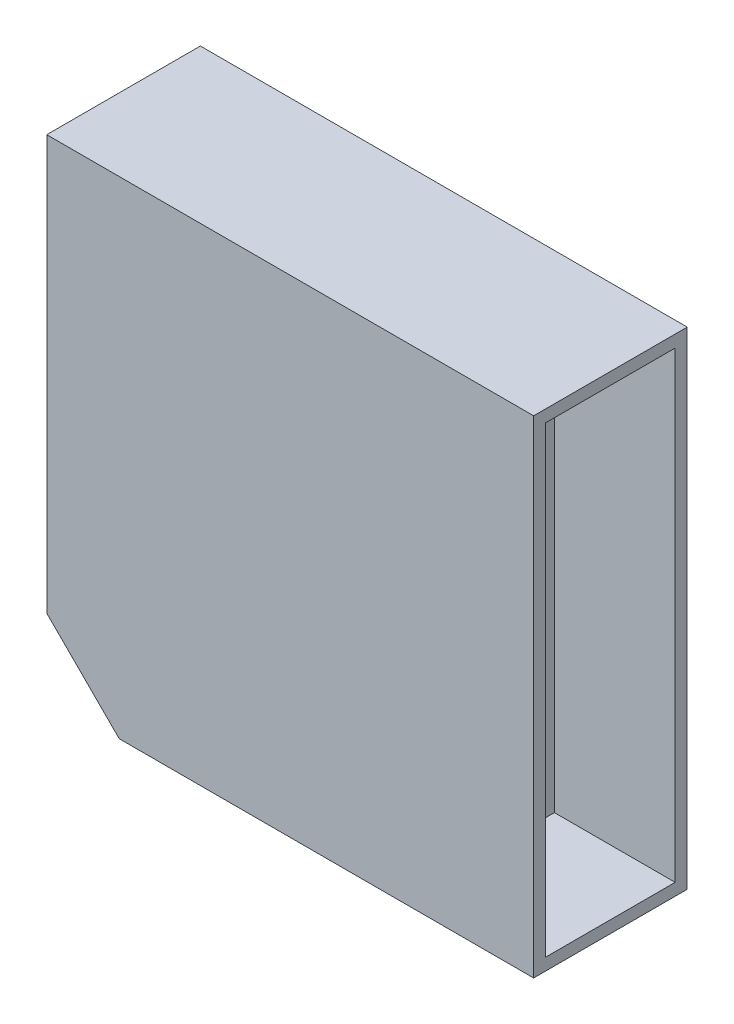
ISO-10303-21;
HEADER;
FILE_DESCRIPTION(('STEP AP214'),'2;1');
FILE_NAME('part.step','',(''),(''),'','','');
FILE_SCHEMA(('AUTOMOTIVE_DESIGN { 1 0 10303 214 1 1 1 1 }'));
ENDSEC;
DATA;
#1=APPLICATION_CONTEXT('core data for automotive mechanical design processes');
#2=APPLICATION_PROTOCOL_DEFINITION('international standard','automotive_design',2000,#1);
#3=PRODUCT_CONTEXT('',#1,'mechanical');
#4=PRODUCT('Part','Part','',(#3));
#5=PRODUCT_RELATED_PRODUCT_CATEGORY('part','',(#4));
#6=PRODUCT_DEFINITION_FORMATION('','',#4);
#7=PRODUCT_DEFINITION_CONTEXT('part definition',#1,'design');
#8=PRODUCT_DEFINITION('design','',#6,#7);
#9=PRODUCT_DEFINITION_SHAPE('','',#8);
#10=(LENGTH_UNIT() NAMED_UNIT(*) SI_UNIT(.MILLI.,.METRE.));
#11=(NAMED_UNIT(*) PLANE_ANGLE_UNIT() SI_UNIT($,.RADIAN.));
#12=(NAMED_UNIT(*) SI_UNIT($,.STERADIAN.) SOLID_ANGLE_UNIT());
#13=UNCERTAINTY_MEASURE_WITH_UNIT(LENGTH_MEASURE(1.E-05),#10,'distance_accuracy_value','');
#14=(GEOMETRIC_REPRESENTATION_CONTEXT(3) GLOBAL_UNCERTAINTY_ASSIGNED_CONTEXT((#13)) GLOBAL_UNIT_ASSIGNED_CONTEXT((#10,
#11,#12)) REPRESENTATION_CONTEXT('',''));
#15=CARTESIAN_POINT('',(0.,0.,0.));
#16=DIRECTION('',(0.,0.,1.));
#17=DIRECTION('',(1.,0.,0.));
#18=AXIS2_PLACEMENT_3D('',#15,#16,#17);
#19=CARTESIAN_POINT('',(10.08,10.08,6.36));
#20=DIRECTION('',(-1.,0.,0.));
#21=DIRECTION('',(0.,-1.,0.));
#22=AXIS2_PLACEMENT_3D('',#19,#20,#21);
#23=PLANE('',#22);
#24=DIRECTION('',(0.,1.,0.));
#25=VECTOR('',#24,1.);
#26=CARTESIAN_POINT('',(10.08,-9.58,0.5));
#27=LINE('',#26,#25);
#28=CARTESIAN_POINT('',(10.08,-9.58,0.5));
#29=VERTEX_POINT('',#28);
#30=CARTESIAN_POINT('',(10.08,9.58,0.5));
#31=VERTEX_POINT('',#30);
#32=EDGE_CURVE('E138',#29,#31,#27,.T.);
#33=ORIENTED_EDGE('',*,*,#32,.F.);
#34=DIRECTION('',(0.,0.,-1.));
#35=VECTOR('',#34,1.);
#36=CARTESIAN_POINT('',(10.08,-9.58,5.86));
#37=LINE('',#36,#35);
#38=CARTESIAN_POINT('',(10.08,-9.58,5.86));
#39=VERTEX_POINT('',#38);
#40=EDGE_CURVE('E112',#39,#29,#37,.T.);
#41=ORIENTED_EDGE('',*,*,#40,.F.);
#42=DIRECTION('',(0.,-1.,0.));
#43=VECTOR('',#42,1.);
#44=CARTESIAN_POINT('',(10.08,9.58,5.86));
#45=LINE('',#44,#43);
#46=CARTESIAN_POINT('',(10.08,9.58,5.86));
#47=VERTEX_POINT('',#46);
#48=EDGE_CURVE('E129',#47,#39,#45,.T.);
#49=ORIENTED_EDGE('',*,*,#48,.F.);
#50=DIRECTION('',(0.,0.,1.));
#51=VECTOR('',#50,1.);
#52=CARTESIAN_POINT('',(10.08,9.58,0.5));
#53=LINE('',#52,#51);
#54=EDGE_CURVE('E132',#31,#47,#53,.T.);
#55=ORIENTED_EDGE('',*,*,#54,.F.);
#56=EDGE_LOOP('',(#33,#41,#49,#55));
#57=FACE_BOUND('',#56,.T.);
#58=DIRECTION('',(0.,1.,0.));
#59=VECTOR('',#58,1.);
#60=CARTESIAN_POINT('',(10.08,10.08,0.));
#61=LINE('',#60,#59);
#62=CARTESIAN_POINT('',(10.08,-10.08,0.));
#63=VERTEX_POINT('',#62);
#64=CARTESIAN_POINT('',(10.08,10.08,0.));
#65=VERTEX_POINT('',#64);
#66=EDGE_CURVE('E144',#63,#65,#61,.T.);
#67=ORIENTED_EDGE('',*,*,#66,.T.);
#68=DIRECTION('',(0.,0.,-1.));
#69=VECTOR('',#68,1.);
#70=CARTESIAN_POINT('',(10.08,10.08,6.36));
#71=LINE('',#70,#69);
#72=CARTESIAN_POINT('',(10.08,10.08,6.36));
#73=VERTEX_POINT('',#72);
#74=EDGE_CURVE('E171',#73,#65,#71,.T.);
#75=ORIENTED_EDGE('',*,*,#74,.F.);
#76=DIRECTION('',(0.,1.,0.));
#77=VECTOR('',#76,1.);
#78=CARTESIAN_POINT('',(10.08,10.08,6.36));
#79=LINE('',#78,#77);
#80=CARTESIAN_POINT('',(10.08,-10.08,6.36));
#81=VERTEX_POINT('',#80);
#82=EDGE_CURVE('E148',#81,#73,#79,.T.);
#83=ORIENTED_EDGE('',*,*,#82,.F.);
#84=DIRECTION('',(0.,0.,-1.));
#85=VECTOR('',#84,1.);
#86=CARTESIAN_POINT('',(10.08,-10.08,6.36));
#87=LINE('',#86,#85);
#88=EDGE_CURVE('E158',#81,#63,#87,.T.);
#89=ORIENTED_EDGE('',*,*,#88,.T.);
#90=EDGE_LOOP('',(#67,#75,#83,#89));
#91=FACE_BOUND('',#90,.T.);
#92=ADVANCED_FACE('F34',(#57,#91),#23,.F.);
#93=CARTESIAN_POINT('',(-10.08,10.08,6.36));
#94=DIRECTION('',(0.,-1.,0.));
#95=DIRECTION('',(0.,0.,-1.));
#96=AXIS2_PLACEMENT_3D('',#93,#94,#95);
#97=PLANE('',#96);
#98=DIRECTION('',(-1.,0.,0.));
#99=VECTOR('',#98,1.);
#100=CARTESIAN_POINT('',(-10.08,10.08,0.));
#101=LINE('',#100,#99);
#102=CARTESIAN_POINT('',(-10.08,10.08,0.));
#103=VERTEX_POINT('',#102);
#104=EDGE_CURVE('E161',#65,#103,#101,.T.);
#105=ORIENTED_EDGE('',*,*,#104,.T.);
#106=DIRECTION('',(0.,0.,-1.));
#107=VECTOR('',#106,1.);
#108=CARTESIAN_POINT('',(-10.08,10.08,6.36));
#109=LINE('',#108,#107);
#110=CARTESIAN_POINT('',(-10.08,10.08,6.36));
#111=VERTEX_POINT('',#110);
#112=EDGE_CURVE('E168',#111,#103,#109,.T.);
#113=ORIENTED_EDGE('',*,*,#112,.F.);
#114=DIRECTION('',(-1.,0.,0.));
#115=VECTOR('',#114,1.);
#116=CARTESIAN_POINT('',(-10.08,10.08,6.36));
#117=LINE('',#116,#115);
#118=EDGE_CURVE('E151',#73,#111,#117,.T.);
#119=ORIENTED_EDGE('',*,*,#118,.F.);
#120=ORIENTED_EDGE('',*,*,#74,.T.);
#121=EDGE_LOOP('',(#105,#113,#119,#120));
#122=FACE_BOUND('',#121,.T.);
#123=ADVANCED_FACE('F198',(#122),#97,.F.);
#124=CARTESIAN_POINT('',(-10.08,10.08,6.36));
#125=DIRECTION('',(1.,0.,0.));
#126=DIRECTION('',(0.,1.,0.));
#127=AXIS2_PLACEMENT_3D('',#124,#125,#126);
#128=PLANE('',#127);
#129=DIRECTION('',(0.,-1.,0.));
#130=VECTOR('',#129,1.);
#131=CARTESIAN_POINT('',(-10.08,10.08,0.));
#132=LINE('',#131,#130);
#133=CARTESIAN_POINT('',(-10.08,-7.07999999999998,0.));
#134=VERTEX_POINT('',#133);
#135=EDGE_CURVE('E163',#103,#134,#132,.T.);
#136=ORIENTED_EDGE('',*,*,#135,.T.);
#137=DIRECTION('',(0.,0.,1.));
#138=VECTOR('',#137,1.);
#139=CARTESIAN_POINT('',(-10.08,-7.07999999999998,6.36));
#140=LINE('',#139,#138);
#141=CARTESIAN_POINT('',(-10.08,-7.07999999999998,6.36));
#142=VERTEX_POINT('',#141);
#143=EDGE_CURVE('E42',#134,#142,#140,.T.);
#144=ORIENTED_EDGE('',*,*,#143,.T.);
#145=DIRECTION('',(0.,-1.,0.));
#146=VECTOR('',#145,1.);
#147=CARTESIAN_POINT('',(-10.08,10.08,6.36));
#148=LINE('',#147,#146);
#149=EDGE_CURVE('E154',#111,#142,#148,.T.);
#150=ORIENTED_EDGE('',*,*,#149,.F.);
#151=ORIENTED_EDGE('',*,*,#112,.T.);
#152=EDGE_LOOP('',(#136,#144,#150,#151));
#153=FACE_BOUND('',#152,.T.);
#154=ADVANCED_FACE('F203',(#153),#128,.F.);
#155=CARTESIAN_POINT('',(-10.08,-10.08,6.36));
#156=DIRECTION('',(0.,1.,0.));
#157=DIRECTION('',(0.,0.,1.));
#158=AXIS2_PLACEMENT_3D('',#155,#156,#157);
#159=PLANE('',#158);
#160=DIRECTION('',(1.,0.,0.));
#161=VECTOR('',#160,1.);
#162=CARTESIAN_POINT('',(-10.08,-10.08,6.36));
#163=LINE('',#162,#161);
#164=CARTESIAN_POINT('',(-7.08,-10.08,6.36));
#165=VERTEX_POINT('',#164);
#166=EDGE_CURVE('E156',#165,#81,#163,.T.);
#167=ORIENTED_EDGE('',*,*,#166,.F.);
#168=DIRECTION('',(0.,0.,-1.));
#169=VECTOR('',#168,1.);
#170=CARTESIAN_POINT('',(-7.08,-10.08,6.36));
#171=LINE('',#170,#169);
#172=CARTESIAN_POINT('',(-7.08,-10.08,0.));
#173=VERTEX_POINT('',#172);
#174=EDGE_CURVE('E174',#165,#173,#171,.T.);
#175=ORIENTED_EDGE('',*,*,#174,.T.);
#176=DIRECTION('',(1.,0.,0.));
#177=VECTOR('',#176,1.);
#178=CARTESIAN_POINT('',(-10.08,-10.08,0.));
#179=LINE('',#178,#177);
#180=EDGE_CURVE('E152',#173,#63,#179,.T.);
#181=ORIENTED_EDGE('',*,*,#180,.T.);
#182=ORIENTED_EDGE('',*,*,#88,.F.);
#183=EDGE_LOOP('',(#167,#175,#181,#182));
#184=FACE_BOUND('',#183,.T.);
#185=ADVANCED_FACE('F180',(#184),#159,.F.);
#186=CARTESIAN_POINT('',(0.,0.,6.36));
#187=DIRECTION('',(0.,0.,1.));
#188=DIRECTION('',(1.,0.,0.));
#189=AXIS2_PLACEMENT_3D('',#186,#187,#188);
#190=PLANE('',#189);
#191=ORIENTED_EDGE('',*,*,#149,.T.);
#192=DIRECTION('',(-0.707106781186545,0.70710678118655,0.));
#193=VECTOR('',#192,1.);
#194=CARTESIAN_POINT('',(-8.58000000000002,-8.57999999999997,6.36));
#195=LINE('',#194,#193);
#196=EDGE_CURVE('E11',#142,#165,#195,.F.);
#197=ORIENTED_EDGE('',*,*,#196,.T.);
#198=ORIENTED_EDGE('',*,*,#166,.T.);
#199=ORIENTED_EDGE('',*,*,#82,.T.);
#200=ORIENTED_EDGE('',*,*,#118,.T.);
#201=EDGE_LOOP('',(#191,#197,#198,#199,#200));
#202=FACE_BOUND('',#201,.T.);
#203=ADVANCED_FACE('F190',(#202),#190,.T.);
#204=CARTESIAN_POINT('',(0.,0.,0.));
#205=DIRECTION('',(0.,0.,1.));
#206=DIRECTION('',(1.,0.,0.));
#207=AXIS2_PLACEMENT_3D('',#204,#205,#206);
#208=PLANE('',#207);
#209=ORIENTED_EDGE('',*,*,#180,.F.);
#210=DIRECTION('',(0.707106781186545,-0.70710678118655,0.));
#211=VECTOR('',#210,1.);
#212=CARTESIAN_POINT('',(-7.08,-10.08,0.));
#213=LINE('',#212,#211);
#214=EDGE_CURVE('E56',#173,#134,#213,.F.);
#215=ORIENTED_EDGE('',*,*,#214,.T.);
#216=ORIENTED_EDGE('',*,*,#135,.F.);
#217=ORIENTED_EDGE('',*,*,#104,.F.);
#218=ORIENTED_EDGE('',*,*,#66,.F.);
#219=EDGE_LOOP('',(#209,#215,#216,#217,#218));
#220=FACE_BOUND('',#219,.T.);
#221=ADVANCED_FACE('F185',(#220),#208,.F.);
#222=CARTESIAN_POINT('',(5.08,-9.58,5.86));
#223=DIRECTION('',(0.,-1.,0.));
#224=DIRECTION('',(1.,0.,0.));
#225=AXIS2_PLACEMENT_3D('',#222,#223,#224);
#226=PLANE('',#225);
#227=ORIENTED_EDGE('',*,*,#40,.T.);
#228=DIRECTION('',(1.,0.,0.));
#229=VECTOR('',#228,1.);
#230=CARTESIAN_POINT('',(5.08,-9.58,0.5));
#231=LINE('',#230,#229);
#232=CARTESIAN_POINT('',(5.08,-9.58,0.5));
#233=VERTEX_POINT('',#232);
#234=EDGE_CURVE('E105',#233,#29,#231,.T.);
#235=ORIENTED_EDGE('',*,*,#234,.F.);
#236=DIRECTION('',(0.,0.,-1.));
#237=VECTOR('',#236,1.);
#238=CARTESIAN_POINT('',(5.08,-9.58,5.86));
#239=LINE('',#238,#237);
#240=CARTESIAN_POINT('',(5.08,-9.58,5.86));
#241=VERTEX_POINT('',#240);
#242=EDGE_CURVE('E109',#241,#233,#239,.T.);
#243=ORIENTED_EDGE('',*,*,#242,.F.);
#244=DIRECTION('',(1.,0.,0.));
#245=VECTOR('',#244,1.);
#246=CARTESIAN_POINT('',(5.08,-9.58,5.86));
#247=LINE('',#246,#245);
#248=EDGE_CURVE('E142',#241,#39,#247,.T.);
#249=ORIENTED_EDGE('',*,*,#248,.T.);
#250=EDGE_LOOP('',(#227,#235,#243,#249));
#251=FACE_BOUND('',#250,.T.);
#252=ADVANCED_FACE('F107',(#251),#226,.F.);
#253=CARTESIAN_POINT('',(5.08,9.58,5.86));
#254=DIRECTION('',(0.,0.,1.));
#255=DIRECTION('',(1.,0.,0.));
#256=AXIS2_PLACEMENT_3D('',#253,#254,#255);
#257=PLANE('',#256);
#258=ORIENTED_EDGE('',*,*,#48,.T.);
#259=ORIENTED_EDGE('',*,*,#248,.F.);
#260=DIRECTION('',(0.,-1.,0.));
#261=VECTOR('',#260,1.);
#262=CARTESIAN_POINT('',(5.08,9.58,5.86));
#263=LINE('',#262,#261);
#264=CARTESIAN_POINT('',(5.08,9.58,5.86));
#265=VERTEX_POINT('',#264);
#266=EDGE_CURVE('E117',#265,#241,#263,.T.);
#267=ORIENTED_EDGE('',*,*,#266,.F.);
#268=DIRECTION('',(1.,0.,0.));
#269=VECTOR('',#268,1.);
#270=CARTESIAN_POINT('',(5.08,9.58,5.86));
#271=LINE('',#270,#269);
#272=EDGE_CURVE('E145',#265,#47,#271,.T.);
#273=ORIENTED_EDGE('',*,*,#272,.T.);
#274=EDGE_LOOP('',(#258,#259,#267,#273));
#275=FACE_BOUND('',#274,.T.);
#276=ADVANCED_FACE('F217',(#275),#257,.F.);
#277=CARTESIAN_POINT('',(5.08,9.58,0.5));
#278=DIRECTION('',(0.,1.,0.));
#279=DIRECTION('',(-1.,0.,0.));
#280=AXIS2_PLACEMENT_3D('',#277,#278,#279);
#281=PLANE('',#280);
#282=ORIENTED_EDGE('',*,*,#54,.T.);
#283=ORIENTED_EDGE('',*,*,#272,.F.);
#284=DIRECTION('',(0.,0.,1.));
#285=VECTOR('',#284,1.);
#286=CARTESIAN_POINT('',(5.08,9.58,0.5));
#287=LINE('',#286,#285);
#288=CARTESIAN_POINT('',(5.08,9.58,0.5));
#289=VERTEX_POINT('',#288);
#290=EDGE_CURVE('E125',#289,#265,#287,.T.);
#291=ORIENTED_EDGE('',*,*,#290,.F.);
#292=DIRECTION('',(1.,0.,0.));
#293=VECTOR('',#292,1.);
#294=CARTESIAN_POINT('',(5.08,9.58,0.5));
#295=LINE('',#294,#293);
#296=EDGE_CURVE('E116',#289,#31,#295,.T.);
#297=ORIENTED_EDGE('',*,*,#296,.T.);
#298=EDGE_LOOP('',(#282,#283,#291,#297));
#299=FACE_BOUND('',#298,.T.);
#300=ADVANCED_FACE('F220',(#299),#281,.F.);
#301=CARTESIAN_POINT('',(5.08,-9.58,0.5));
#302=DIRECTION('',(0.,0.,-1.));
#303=DIRECTION('',(-1.,0.,0.));
#304=AXIS2_PLACEMENT_3D('',#301,#302,#303);
#305=PLANE('',#304);
#306=ORIENTED_EDGE('',*,*,#32,.T.);
#307=ORIENTED_EDGE('',*,*,#296,.F.);
#308=DIRECTION('',(0.,1.,0.));
#309=VECTOR('',#308,1.);
#310=CARTESIAN_POINT('',(5.08,-9.58,0.5));
#311=LINE('',#310,#309);
#312=EDGE_CURVE('E120',#233,#289,#311,.T.);
#313=ORIENTED_EDGE('',*,*,#312,.F.);
#314=ORIENTED_EDGE('',*,*,#234,.T.);
#315=EDGE_LOOP('',(#306,#307,#313,#314));
#316=FACE_BOUND('',#315,.T.);
#317=ADVANCED_FACE('F121',(#316),#305,.F.);
#318=CARTESIAN_POINT('',(5.08,0.,0.));
#319=DIRECTION('',(1.,0.,0.));
#320=DIRECTION('',(0.,0.,-1.));
#321=AXIS2_PLACEMENT_3D('',#318,#319,#320);
#322=PLANE('',#321);
#323=ORIENTED_EDGE('',*,*,#242,.T.);
#324=ORIENTED_EDGE('',*,*,#312,.T.);
#325=ORIENTED_EDGE('',*,*,#290,.T.);
#326=ORIENTED_EDGE('',*,*,#266,.T.);
#327=EDGE_LOOP('',(#323,#324,#325,#326));
#328=FACE_BOUND('',#327,.T.);
#329=ADVANCED_FACE('F127',(#328),#322,.T.);
#330=CARTESIAN_POINT('',(-7.08,-10.08,6.36));
#331=DIRECTION('',(0.70710678118655,0.707106781186545,0.));
#332=DIRECTION('',(0.,0.,-1.));
#333=AXIS2_PLACEMENT_3D('',#330,#331,#332);
#334=PLANE('',#333);
#335=ORIENTED_EDGE('',*,*,#196,.F.);
#336=ORIENTED_EDGE('',*,*,#143,.F.);
#337=ORIENTED_EDGE('',*,*,#214,.F.);
#338=ORIENTED_EDGE('',*,*,#174,.F.);
#339=EDGE_LOOP('',(#335,#336,#337,#338));
#340=FACE_BOUND('',#339,.T.);
#341=ADVANCED_FACE('F36',(#340),#334,.F.);
#342=CLOSED_SHELL('',(#92,#123,#154,#185,#203,#221,#252,#276,#300,#317,#329,#341));
#343=MANIFOLD_SOLID_BREP('B2',#342);
#344=ADVANCED_BREP_SHAPE_REPRESENTATION('',(#18,#343),#14);
#345=SHAPE_DEFINITION_REPRESENTATION(#9,#344);
ENDSEC;
END-ISO-10303-21;
